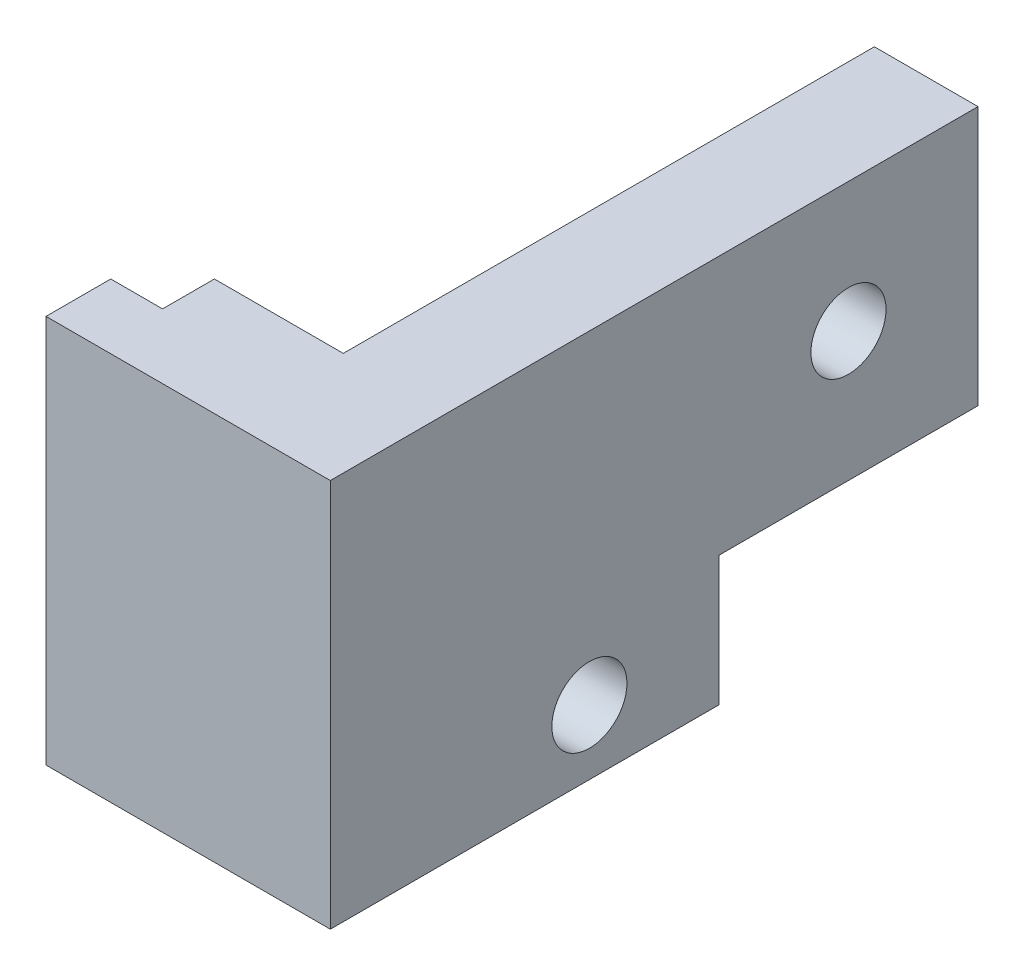
ISO-10303-21;
HEADER;
FILE_DESCRIPTION(('STEP AP214'),'2;1');
FILE_NAME('part.step','',(''),(''),'','','');
FILE_SCHEMA(('AUTOMOTIVE_DESIGN { 1 0 10303 214 1 1 1 1 }'));
ENDSEC;
DATA;
#1=APPLICATION_CONTEXT('core data for automotive mechanical design processes');
#2=APPLICATION_PROTOCOL_DEFINITION('international standard','automotive_design',2000,#1);
#3=PRODUCT_CONTEXT('',#1,'mechanical');
#4=PRODUCT('Part','Part','',(#3));
#5=PRODUCT_RELATED_PRODUCT_CATEGORY('part','',(#4));
#6=PRODUCT_DEFINITION_FORMATION('','',#4);
#7=PRODUCT_DEFINITION_CONTEXT('part definition',#1,'design');
#8=PRODUCT_DEFINITION('design','',#6,#7);
#9=PRODUCT_DEFINITION_SHAPE('','',#8);
#10=(LENGTH_UNIT() NAMED_UNIT(*) SI_UNIT(.MILLI.,.METRE.));
#11=(NAMED_UNIT(*) PLANE_ANGLE_UNIT() SI_UNIT($,.RADIAN.));
#12=(NAMED_UNIT(*) SI_UNIT($,.STERADIAN.) SOLID_ANGLE_UNIT());
#13=UNCERTAINTY_MEASURE_WITH_UNIT(LENGTH_MEASURE(1.E-05),#10,'distance_accuracy_value','');
#14=(GEOMETRIC_REPRESENTATION_CONTEXT(3) GLOBAL_UNCERTAINTY_ASSIGNED_CONTEXT((#13)) GLOBAL_UNIT_ASSIGNED_CONTEXT((#10,
#11,#12)) REPRESENTATION_CONTEXT('',''));
#15=CARTESIAN_POINT('',(0.,0.,0.));
#16=DIRECTION('',(0.,0.,1.));
#17=DIRECTION('',(1.,0.,0.));
#18=AXIS2_PLACEMENT_3D('',#15,#16,#17);
#19=CARTESIAN_POINT('',(0.,0.,0.));
#20=DIRECTION('',(0.,0.,1.));
#21=DIRECTION('',(1.,0.,0.));
#22=AXIS2_PLACEMENT_3D('',#19,#20,#21);
#23=PLANE('',#22);
#24=DIRECTION('',(1.,0.,0.));
#25=VECTOR('',#24,1.);
#26=CARTESIAN_POINT('',(0.,0.,0.));
#27=LINE('',#26,#25);
#28=CARTESIAN_POINT('',(-33.95,0.,0.));
#29=VERTEX_POINT('',#28);
#30=CARTESIAN_POINT('',(-29.95,0.,0.));
#31=VERTEX_POINT('',#30);
#32=EDGE_CURVE('E143',#29,#31,#27,.T.);
#33=ORIENTED_EDGE('',*,*,#32,.F.);
#34=DIRECTION('',(0.,-1.,0.));
#35=VECTOR('',#34,1.);
#36=CARTESIAN_POINT('',(-33.95,30.,0.));
#37=LINE('',#36,#35);
#38=CARTESIAN_POINT('',(-33.95,30.,0.));
#39=VERTEX_POINT('',#38);
#40=EDGE_CURVE('E137',#39,#29,#37,.T.);
#41=ORIENTED_EDGE('',*,*,#40,.F.);
#42=DIRECTION('',(-1.,0.,0.));
#43=VECTOR('',#42,1.);
#44=CARTESIAN_POINT('',(0.,30.,0.));
#45=LINE('',#44,#43);
#46=CARTESIAN_POINT('',(-29.95,30.,0.));
#47=VERTEX_POINT('',#46);
#48=EDGE_CURVE('E64',#47,#39,#45,.T.);
#49=ORIENTED_EDGE('',*,*,#48,.F.);
#50=DIRECTION('',(0.,1.,0.));
#51=VECTOR('',#50,1.);
#52=CARTESIAN_POINT('',(-29.95,30.,0.));
#53=LINE('',#52,#51);
#54=EDGE_CURVE('E542',#31,#47,#53,.T.);
#55=ORIENTED_EDGE('',*,*,#54,.F.);
#56=EDGE_LOOP('',(#33,#41,#49,#55));
#57=FACE_BOUND('',#56,.T.);
#58=ADVANCED_FACE('F39',(#57),#23,.F.);
#59=CARTESIAN_POINT('',(-20.,30.,-5.));
#60=DIRECTION('',(1.,0.,0.));
#61=DIRECTION('',(0.,0.,-1.));
#62=AXIS2_PLACEMENT_3D('',#59,#60,#61);
#63=PLANE('',#62);
#64=CARTESIAN_POINT('',(-20.,5.,-15.));
#65=DIRECTION('',(1.,0.,0.));
#66=DIRECTION('',(0.,0.,-1.));
#67=AXIS2_PLACEMENT_3D('',#64,#65,#66);
#68=CIRCLE('',#67,1.5);
#69=CARTESIAN_POINT('',(-20.,5.,-16.5));
#70=VERTEX_POINT('',#69);
#71=EDGE_CURVE('E156',#70,#70,#68,.T.);
#72=ORIENTED_EDGE('',*,*,#71,.T.);
#73=EDGE_LOOP('',(#72));
#74=FACE_BOUND('',#73,.T.);
#75=CARTESIAN_POINT('',(-20.,20.,-35.));
#76=DIRECTION('',(1.,0.,0.));
#77=DIRECTION('',(0.,0.,-1.));
#78=AXIS2_PLACEMENT_3D('',#75,#76,#77);
#79=CIRCLE('',#78,1.5);
#80=CARTESIAN_POINT('',(-20.,20.,-36.5));
#81=VERTEX_POINT('',#80);
#82=EDGE_CURVE('E233',#81,#81,#79,.T.);
#83=ORIENTED_EDGE('',*,*,#82,.T.);
#84=EDGE_LOOP('',(#83));
#85=FACE_BOUND('',#84,.T.);
#86=DIRECTION('',(0.,-1.,0.));
#87=VECTOR('',#86,1.);
#88=CARTESIAN_POINT('',(-20.,30.,-4.));
#89=LINE('',#88,#87);
#90=CARTESIAN_POINT('',(-20.,30.,-4.));
#91=VERTEX_POINT('',#90);
#92=CARTESIAN_POINT('',(-20.,0.,-4.));
#93=VERTEX_POINT('',#92);
#94=EDGE_CURVE('E279',#91,#93,#89,.T.);
#95=ORIENTED_EDGE('',*,*,#94,.F.);
#96=DIRECTION('',(0.,0.,1.));
#97=VECTOR('',#96,1.);
#98=CARTESIAN_POINT('',(-20.,30.,-5.));
#99=LINE('',#98,#97);
#100=CARTESIAN_POINT('',(-20.,30.,-45.));
#101=VERTEX_POINT('',#100);
#102=EDGE_CURVE('E151',#101,#91,#99,.T.);
#103=ORIENTED_EDGE('',*,*,#102,.F.);
#104=DIRECTION('',(0.,1.,0.));
#105=VECTOR('',#104,1.);
#106=CARTESIAN_POINT('',(-20.,30.,-45.));
#107=LINE('',#106,#105);
#108=CARTESIAN_POINT('',(-20.,17.,-45.));
#109=VERTEX_POINT('',#108);
#110=EDGE_CURVE('E205',#109,#101,#107,.T.);
#111=ORIENTED_EDGE('',*,*,#110,.F.);
#112=DIRECTION('',(0.,0.,-1.));
#113=VECTOR('',#112,1.);
#114=CARTESIAN_POINT('',(-20.,17.,-45.));
#115=LINE('',#114,#113);
#116=CARTESIAN_POINT('',(-20.,17.,-18.));
#117=VERTEX_POINT('',#116);
#118=EDGE_CURVE('E226',#117,#109,#115,.T.);
#119=ORIENTED_EDGE('',*,*,#118,.F.);
#120=DIRECTION('',(0.,1.,0.));
#121=VECTOR('',#120,1.);
#122=CARTESIAN_POINT('',(-20.,0.,-18.));
#123=LINE('',#122,#121);
#124=CARTESIAN_POINT('',(-20.,0.,-18.));
#125=VERTEX_POINT('',#124);
#126=EDGE_CURVE('E230',#125,#117,#123,.T.);
#127=ORIENTED_EDGE('',*,*,#126,.F.);
#128=DIRECTION('',(0.,0.,1.));
#129=VECTOR('',#128,1.);
#130=CARTESIAN_POINT('',(-20.,0.,-5.));
#131=LINE('',#130,#129);
#132=EDGE_CURVE('E148',#125,#93,#131,.T.);
#133=ORIENTED_EDGE('',*,*,#132,.T.);
#134=EDGE_LOOP('',(#95,#103,#111,#119,#127,#133));
#135=FACE_BOUND('',#134,.T.);
#136=ADVANCED_FACE('F260',(#74,#85,#135),#63,.F.);
#137=CARTESIAN_POINT('',(-26.2,20.,-35.));
#138=DIRECTION('',(1.,0.,0.));
#139=DIRECTION('',(0.,0.,-1.));
#140=AXIS2_PLACEMENT_3D('',#137,#138,#139);
#141=CYLINDRICAL_SURFACE('',#140,1.5);
#142=ORIENTED_EDGE('',*,*,#82,.F.);
#143=EDGE_LOOP('',(#142));
#144=FACE_BOUND('',#143,.T.);
#145=CARTESIAN_POINT('',(-18.,20.,-35.));
#146=DIRECTION('',(1.,0.,0.));
#147=DIRECTION('',(0.,0.,-1.));
#148=AXIS2_PLACEMENT_3D('',#145,#146,#147);
#149=CIRCLE('',#148,1.5);
#150=CARTESIAN_POINT('',(-18.,20.,-36.5));
#151=VERTEX_POINT('',#150);
#152=EDGE_CURVE('E43',#151,#151,#149,.F.);
#153=ORIENTED_EDGE('',*,*,#152,.F.);
#154=EDGE_LOOP('',(#153));
#155=FACE_BOUND('',#154,.T.);
#156=ADVANCED_FACE('F293',(#144,#155),#141,.F.);
#157=CARTESIAN_POINT('',(0.,0.,-25.));
#158=DIRECTION('',(0.,0.,-1.));
#159=DIRECTION('',(-1.,0.,0.));
#160=AXIS2_PLACEMENT_3D('',#157,#158,#159);
#161=PLANE('',#160);
#162=DIRECTION('',(-1.,0.,0.));
#163=VECTOR('',#162,1.);
#164=CARTESIAN_POINT('',(-15.,0.,-25.));
#165=LINE('',#164,#163);
#166=CARTESIAN_POINT('',(-12.,0.,-25.));
#167=VERTEX_POINT('',#166);
#168=CARTESIAN_POINT('',(-15.8,0.,-25.));
#169=VERTEX_POINT('',#168);
#170=EDGE_CURVE('E184',#167,#169,#165,.T.);
#171=ORIENTED_EDGE('',*,*,#170,.T.);
#172=DIRECTION('',(0.,-1.,0.));
#173=VECTOR('',#172,1.);
#174=CARTESIAN_POINT('',(-15.8,0.,-25.));
#175=LINE('',#174,#173);
#176=CARTESIAN_POINT('',(-15.8,9.99999999999999,-25.));
#177=VERTEX_POINT('',#176);
#178=EDGE_CURVE('E228',#177,#169,#175,.T.);
#179=ORIENTED_EDGE('',*,*,#178,.F.);
#180=DIRECTION('',(-1.,0.,0.));
#181=VECTOR('',#180,1.);
#182=CARTESIAN_POINT('',(-20.,9.99999999999999,-25.));
#183=LINE('',#182,#181);
#184=CARTESIAN_POINT('',(-12.,9.99999999999999,-25.));
#185=VERTEX_POINT('',#184);
#186=EDGE_CURVE('E216',#185,#177,#183,.T.);
#187=ORIENTED_EDGE('',*,*,#186,.F.);
#188=DIRECTION('',(0.,1.,0.));
#189=VECTOR('',#188,1.);
#190=CARTESIAN_POINT('',(-12.,0.,-25.));
#191=LINE('',#190,#189);
#192=EDGE_CURVE('E181',#167,#185,#191,.T.);
#193=ORIENTED_EDGE('',*,*,#192,.F.);
#194=EDGE_LOOP('',(#171,#179,#187,#193));
#195=FACE_BOUND('',#194,.T.);
#196=ADVANCED_FACE('F296',(#195),#161,.T.);
#197=CARTESIAN_POINT('',(-20.,9.99999999999999,-45.));
#198=DIRECTION('',(0.,1.,0.));
#199=DIRECTION('',(0.,0.,1.));
#200=AXIS2_PLACEMENT_3D('',#197,#198,#199);
#201=PLANE('',#200);
#202=DIRECTION('',(0.,0.,1.));
#203=VECTOR('',#202,1.);
#204=CARTESIAN_POINT('',(-15.8,9.99999999999999,-45.));
#205=LINE('',#204,#203);
#206=CARTESIAN_POINT('',(-15.8,9.99999999999999,-45.));
#207=VERTEX_POINT('',#206);
#208=EDGE_CURVE('E222',#207,#177,#205,.T.);
#209=ORIENTED_EDGE('',*,*,#208,.F.);
#210=DIRECTION('',(-1.,0.,0.));
#211=VECTOR('',#210,1.);
#212=CARTESIAN_POINT('',(-20.,9.99999999999999,-45.));
#213=LINE('',#212,#211);
#214=CARTESIAN_POINT('',(-12.,9.99999999999999,-45.));
#215=VERTEX_POINT('',#214);
#216=EDGE_CURVE('E211',#215,#207,#213,.T.);
#217=ORIENTED_EDGE('',*,*,#216,.F.);
#218=DIRECTION('',(0.,0.,1.));
#219=VECTOR('',#218,1.);
#220=CARTESIAN_POINT('',(-12.,9.99999999999999,-45.));
#221=LINE('',#220,#219);
#222=EDGE_CURVE('E169',#215,#185,#221,.T.);
#223=ORIENTED_EDGE('',*,*,#222,.T.);
#224=ORIENTED_EDGE('',*,*,#186,.T.);
#225=EDGE_LOOP('',(#209,#217,#223,#224));
#226=FACE_BOUND('',#225,.T.);
#227=ADVANCED_FACE('F221',(#226),#201,.F.);
#228=CARTESIAN_POINT('',(-25.,5.,-15.));
#229=DIRECTION('',(1.,0.,0.));
#230=DIRECTION('',(0.,0.,-1.));
#231=AXIS2_PLACEMENT_3D('',#228,#229,#230);
#232=CYLINDRICAL_SURFACE('',#231,1.5);
#233=ORIENTED_EDGE('',*,*,#71,.F.);
#234=EDGE_LOOP('',(#233));
#235=FACE_BOUND('',#234,.T.);
#236=CARTESIAN_POINT('',(-18.,5.,-15.));
#237=DIRECTION('',(1.,0.,0.));
#238=DIRECTION('',(0.,0.,-1.));
#239=AXIS2_PLACEMENT_3D('',#236,#237,#238);
#240=CIRCLE('',#239,1.5);
#241=CARTESIAN_POINT('',(-18.,5.,-16.5));
#242=VERTEX_POINT('',#241);
#243=EDGE_CURVE('E154',#242,#242,#240,.F.);
#244=ORIENTED_EDGE('',*,*,#243,.F.);
#245=EDGE_LOOP('',(#244));
#246=FACE_BOUND('',#245,.T.);
#247=ADVANCED_FACE('F318',(#235,#246),#232,.F.);
#248=CARTESIAN_POINT('',(0.,30.,5.));
#249=DIRECTION('',(0.,-1.,0.));
#250=DIRECTION('',(1.,0.,0.));
#251=AXIS2_PLACEMENT_3D('',#248,#249,#250);
#252=PLANE('',#251);
#253=ORIENTED_EDGE('',*,*,#48,.T.);
#254=DIRECTION('',(0.,0.,-1.));
#255=VECTOR('',#254,1.);
#256=CARTESIAN_POINT('',(-33.95,30.,5.));
#257=LINE('',#256,#255);
#258=CARTESIAN_POINT('',(-33.95,30.,5.));
#259=VERTEX_POINT('',#258);
#260=EDGE_CURVE('E135',#259,#39,#257,.T.);
#261=ORIENTED_EDGE('',*,*,#260,.F.);
#262=DIRECTION('',(-1.,0.,0.));
#263=VECTOR('',#262,1.);
#264=CARTESIAN_POINT('',(0.,30.,5.));
#265=LINE('',#264,#263);
#266=CARTESIAN_POINT('',(-12.,30.,5.));
#267=VERTEX_POINT('',#266);
#268=EDGE_CURVE('E48',#267,#259,#265,.T.);
#269=ORIENTED_EDGE('',*,*,#268,.F.);
#270=DIRECTION('',(0.,0.,1.));
#271=VECTOR('',#270,1.);
#272=CARTESIAN_POINT('',(-12.,30.,-25.));
#273=LINE('',#272,#271);
#274=CARTESIAN_POINT('',(-12.,30.,-45.));
#275=VERTEX_POINT('',#274);
#276=EDGE_CURVE('E161',#275,#267,#273,.T.);
#277=ORIENTED_EDGE('',*,*,#276,.F.);
#278=DIRECTION('',(1.,0.,0.));
#279=VECTOR('',#278,1.);
#280=CARTESIAN_POINT('',(-20.,30.,-45.));
#281=LINE('',#280,#279);
#282=EDGE_CURVE('E194',#101,#275,#281,.T.);
#283=ORIENTED_EDGE('',*,*,#282,.F.);
#284=ORIENTED_EDGE('',*,*,#102,.T.);
#285=DIRECTION('',(1.,0.,0.));
#286=VECTOR('',#285,1.);
#287=CARTESIAN_POINT('',(-29.95,30.,-4.));
#288=LINE('',#287,#286);
#289=CARTESIAN_POINT('',(-29.95,30.,-4.));
#290=VERTEX_POINT('',#289);
#291=EDGE_CURVE('E271',#290,#91,#288,.T.);
#292=ORIENTED_EDGE('',*,*,#291,.F.);
#293=DIRECTION('',(0.,0.,-1.));
#294=VECTOR('',#293,1.);
#295=CARTESIAN_POINT('',(-29.95,30.,0.));
#296=LINE('',#295,#294);
#297=EDGE_CURVE('E146',#47,#290,#296,.T.);
#298=ORIENTED_EDGE('',*,*,#297,.F.);
#299=EDGE_LOOP('',(#253,#261,#269,#277,#283,#284,#292,#298));
#300=FACE_BOUND('',#299,.T.);
#301=ADVANCED_FACE('F41',(#300),#252,.F.);
#302=CARTESIAN_POINT('',(0.,0.,5.));
#303=DIRECTION('',(0.,1.,0.));
#304=DIRECTION('',(-1.,0.,0.));
#305=AXIS2_PLACEMENT_3D('',#302,#303,#304);
#306=PLANE('',#305);
#307=DIRECTION('',(1.,0.,0.));
#308=VECTOR('',#307,1.);
#309=CARTESIAN_POINT('',(0.,0.,5.));
#310=LINE('',#309,#308);
#311=CARTESIAN_POINT('',(-33.95,0.,5.));
#312=VERTEX_POINT('',#311);
#313=CARTESIAN_POINT('',(-12.,0.,5.));
#314=VERTEX_POINT('',#313);
#315=EDGE_CURVE('E13',#312,#314,#310,.T.);
#316=ORIENTED_EDGE('',*,*,#315,.F.);
#317=DIRECTION('',(0.,0.,1.));
#318=VECTOR('',#317,1.);
#319=CARTESIAN_POINT('',(-33.95,0.,0.));
#320=LINE('',#319,#318);
#321=EDGE_CURVE('E56',#29,#312,#320,.T.);
#322=ORIENTED_EDGE('',*,*,#321,.F.);
#323=ORIENTED_EDGE('',*,*,#32,.T.);
#324=DIRECTION('',(0.,0.,1.));
#325=VECTOR('',#324,1.);
#326=CARTESIAN_POINT('',(-29.95,0.,0.));
#327=LINE('',#326,#325);
#328=CARTESIAN_POINT('',(-29.95,0.,-4.));
#329=VERTEX_POINT('',#328);
#330=EDGE_CURVE('E268',#329,#31,#327,.T.);
#331=ORIENTED_EDGE('',*,*,#330,.F.);
#332=DIRECTION('',(1.,0.,0.));
#333=VECTOR('',#332,1.);
#334=CARTESIAN_POINT('',(-29.95,0.,-4.));
#335=LINE('',#334,#333);
#336=EDGE_CURVE('E266',#329,#93,#335,.T.);
#337=ORIENTED_EDGE('',*,*,#336,.T.);
#338=ORIENTED_EDGE('',*,*,#132,.F.);
#339=DIRECTION('',(-1.,0.,0.));
#340=VECTOR('',#339,1.);
#341=CARTESIAN_POINT('',(-15.8,0.,-18.));
#342=LINE('',#341,#340);
#343=CARTESIAN_POINT('',(-15.8,0.,-18.));
#344=VERTEX_POINT('',#343);
#345=EDGE_CURVE('E245',#344,#125,#342,.T.);
#346=ORIENTED_EDGE('',*,*,#345,.F.);
#347=DIRECTION('',(0.,0.,1.));
#348=VECTOR('',#347,1.);
#349=CARTESIAN_POINT('',(-15.8,0.,-25.));
#350=LINE('',#349,#348);
#351=EDGE_CURVE('E237',#169,#344,#350,.T.);
#352=ORIENTED_EDGE('',*,*,#351,.F.);
#353=ORIENTED_EDGE('',*,*,#170,.F.);
#354=DIRECTION('',(0.,0.,-1.));
#355=VECTOR('',#354,1.);
#356=CARTESIAN_POINT('',(-12.,0.,5.));
#357=LINE('',#356,#355);
#358=EDGE_CURVE('E178',#314,#167,#357,.T.);
#359=ORIENTED_EDGE('',*,*,#358,.F.);
#360=EDGE_LOOP('',(#316,#322,#323,#331,#337,#338,#346,#352,#353,#359));
#361=FACE_BOUND('',#360,.T.);
#362=ADVANCED_FACE('F263',(#361),#306,.F.);
#363=CARTESIAN_POINT('',(0.,0.,5.));
#364=DIRECTION('',(0.,0.,1.));
#365=DIRECTION('',(1.,0.,0.));
#366=AXIS2_PLACEMENT_3D('',#363,#364,#365);
#367=PLANE('',#366);
#368=DIRECTION('',(0.,1.,0.));
#369=VECTOR('',#368,1.);
#370=CARTESIAN_POINT('',(-33.95,0.,5.));
#371=LINE('',#370,#369);
#372=EDGE_CURVE('E138',#312,#259,#371,.T.);
#373=ORIENTED_EDGE('',*,*,#372,.F.);
#374=ORIENTED_EDGE('',*,*,#315,.T.);
#375=DIRECTION('',(0.,-1.,0.));
#376=VECTOR('',#375,1.);
#377=CARTESIAN_POINT('',(-12.,30.,5.));
#378=LINE('',#377,#376);
#379=EDGE_CURVE('E175',#267,#314,#378,.T.);
#380=ORIENTED_EDGE('',*,*,#379,.F.);
#381=ORIENTED_EDGE('',*,*,#268,.T.);
#382=EDGE_LOOP('',(#373,#374,#380,#381));
#383=FACE_BOUND('',#382,.T.);
#384=ADVANCED_FACE('F190',(#383),#367,.T.);
#385=CARTESIAN_POINT('',(-12.,0.,0.));
#386=DIRECTION('',(1.,0.,0.));
#387=DIRECTION('',(0.,0.,-1.));
#388=AXIS2_PLACEMENT_3D('',#385,#386,#387);
#389=PLANE('',#388);
#390=CARTESIAN_POINT('',(-12.,20.,-35.));
#391=DIRECTION('',(1.,0.,0.));
#392=DIRECTION('',(0.,0.,-1.));
#393=AXIS2_PLACEMENT_3D('',#390,#391,#392);
#394=CIRCLE('',#393,2.9);
#395=CARTESIAN_POINT('',(-12.,20.,-37.9));
#396=VERTEX_POINT('',#395);
#397=EDGE_CURVE('E274',#396,#396,#394,.T.);
#398=ORIENTED_EDGE('',*,*,#397,.F.);
#399=EDGE_LOOP('',(#398));
#400=FACE_BOUND('',#399,.T.);
#401=CARTESIAN_POINT('',(-12.,5.,-15.));
#402=DIRECTION('',(1.,0.,0.));
#403=DIRECTION('',(0.,0.,-1.));
#404=AXIS2_PLACEMENT_3D('',#401,#402,#403);
#405=CIRCLE('',#404,2.9);
#406=CARTESIAN_POINT('',(-12.,5.,-17.9));
#407=VERTEX_POINT('',#406);
#408=EDGE_CURVE('E164',#407,#407,#405,.T.);
#409=ORIENTED_EDGE('',*,*,#408,.F.);
#410=EDGE_LOOP('',(#409));
#411=FACE_BOUND('',#410,.T.);
#412=ORIENTED_EDGE('',*,*,#276,.T.);
#413=ORIENTED_EDGE('',*,*,#379,.T.);
#414=ORIENTED_EDGE('',*,*,#358,.T.);
#415=ORIENTED_EDGE('',*,*,#192,.T.);
#416=ORIENTED_EDGE('',*,*,#222,.F.);
#417=DIRECTION('',(0.,-1.,0.));
#418=VECTOR('',#417,1.);
#419=CARTESIAN_POINT('',(-12.,30.,-45.));
#420=LINE('',#419,#418);
#421=EDGE_CURVE('E201',#275,#215,#420,.T.);
#422=ORIENTED_EDGE('',*,*,#421,.F.);
#423=EDGE_LOOP('',(#412,#413,#414,#415,#416,#422));
#424=FACE_BOUND('',#423,.T.);
#425=ADVANCED_FACE('F208',(#400,#411,#424),#389,.T.);
#426=CARTESIAN_POINT('',(-18.,30.,-5.));
#427=DIRECTION('',(1.,0.,0.));
#428=DIRECTION('',(0.,0.,-1.));
#429=AXIS2_PLACEMENT_3D('',#426,#427,#428);
#430=PLANE('',#429);
#431=CARTESIAN_POINT('',(-18.,5.,-15.));
#432=DIRECTION('',(1.,0.,0.));
#433=DIRECTION('',(0.,0.,-1.));
#434=AXIS2_PLACEMENT_3D('',#431,#432,#433);
#435=CIRCLE('',#434,2.9);
#436=CARTESIAN_POINT('',(-18.,5.,-17.9));
#437=VERTEX_POINT('',#436);
#438=EDGE_CURVE('E157',#437,#437,#435,.F.);
#439=ORIENTED_EDGE('',*,*,#438,.F.);
#440=EDGE_LOOP('',(#439));
#441=FACE_BOUND('',#440,.T.);
#442=ORIENTED_EDGE('',*,*,#243,.T.);
#443=EDGE_LOOP('',(#442));
#444=FACE_BOUND('',#443,.T.);
#445=ADVANCED_FACE('F335',(#441,#444),#430,.T.);
#446=CARTESIAN_POINT('',(-28.2024386617639,5.,-15.));
#447=DIRECTION('',(1.,0.,0.));
#448=DIRECTION('',(0.,0.,-1.));
#449=AXIS2_PLACEMENT_3D('',#446,#447,#448);
#450=CYLINDRICAL_SURFACE('',#449,2.9);
#451=ORIENTED_EDGE('',*,*,#438,.T.);
#452=EDGE_LOOP('',(#451));
#453=FACE_BOUND('',#452,.T.);
#454=ORIENTED_EDGE('',*,*,#408,.T.);
#455=EDGE_LOOP('',(#454));
#456=FACE_BOUND('',#455,.T.);
#457=ADVANCED_FACE('F332',(#453,#456),#450,.F.);
#458=CARTESIAN_POINT('',(0.,0.,-45.));
#459=DIRECTION('',(0.,0.,1.));
#460=DIRECTION('',(1.,0.,0.));
#461=AXIS2_PLACEMENT_3D('',#458,#459,#460);
#462=PLANE('',#461);
#463=DIRECTION('',(0.,-1.,0.));
#464=VECTOR('',#463,1.);
#465=CARTESIAN_POINT('',(-15.8,17.,-45.));
#466=LINE('',#465,#464);
#467=CARTESIAN_POINT('',(-15.8,17.,-45.));
#468=VERTEX_POINT('',#467);
#469=EDGE_CURVE('E223',#468,#207,#466,.T.);
#470=ORIENTED_EDGE('',*,*,#469,.F.);
#471=DIRECTION('',(-1.,0.,0.));
#472=VECTOR('',#471,1.);
#473=CARTESIAN_POINT('',(-15.8,17.,-45.));
#474=LINE('',#473,#472);
#475=EDGE_CURVE('E218',#468,#109,#474,.T.);
#476=ORIENTED_EDGE('',*,*,#475,.T.);
#477=ORIENTED_EDGE('',*,*,#110,.T.);
#478=ORIENTED_EDGE('',*,*,#282,.T.);
#479=ORIENTED_EDGE('',*,*,#421,.T.);
#480=ORIENTED_EDGE('',*,*,#216,.T.);
#481=EDGE_LOOP('',(#470,#476,#477,#478,#479,#480));
#482=FACE_BOUND('',#481,.T.);
#483=ADVANCED_FACE('F199',(#482),#462,.F.);
#484=CARTESIAN_POINT('',(-15.8,17.,-45.));
#485=DIRECTION('',(0.,1.,0.));
#486=DIRECTION('',(0.,0.,1.));
#487=AXIS2_PLACEMENT_3D('',#484,#485,#486);
#488=PLANE('',#487);
#489=ORIENTED_EDGE('',*,*,#118,.T.);
#490=ORIENTED_EDGE('',*,*,#475,.F.);
#491=DIRECTION('',(0.,0.,-1.));
#492=VECTOR('',#491,1.);
#493=CARTESIAN_POINT('',(-15.8,17.,-25.));
#494=LINE('',#493,#492);
#495=CARTESIAN_POINT('',(-15.8,17.,-18.));
#496=VERTEX_POINT('',#495);
#497=EDGE_CURVE('E243',#496,#468,#494,.T.);
#498=ORIENTED_EDGE('',*,*,#497,.F.);
#499=DIRECTION('',(-1.,0.,0.));
#500=VECTOR('',#499,1.);
#501=CARTESIAN_POINT('',(-15.8,17.,-18.));
#502=LINE('',#501,#500);
#503=EDGE_CURVE('E249',#496,#117,#502,.T.);
#504=ORIENTED_EDGE('',*,*,#503,.T.);
#505=EDGE_LOOP('',(#489,#490,#498,#504));
#506=FACE_BOUND('',#505,.T.);
#507=ADVANCED_FACE('F349',(#506),#488,.F.);
#508=CARTESIAN_POINT('',(-15.8,0.,-18.));
#509=DIRECTION('',(0.,0.,1.));
#510=DIRECTION('',(1.,0.,0.));
#511=AXIS2_PLACEMENT_3D('',#508,#509,#510);
#512=PLANE('',#511);
#513=ORIENTED_EDGE('',*,*,#126,.T.);
#514=ORIENTED_EDGE('',*,*,#503,.F.);
#515=DIRECTION('',(0.,1.,0.));
#516=VECTOR('',#515,1.);
#517=CARTESIAN_POINT('',(-15.8,0.,-18.));
#518=LINE('',#517,#516);
#519=EDGE_CURVE('E240',#344,#496,#518,.T.);
#520=ORIENTED_EDGE('',*,*,#519,.F.);
#521=ORIENTED_EDGE('',*,*,#345,.T.);
#522=EDGE_LOOP('',(#513,#514,#520,#521));
#523=FACE_BOUND('',#522,.T.);
#524=ADVANCED_FACE('F254',(#523),#512,.F.);
#525=CARTESIAN_POINT('',(-15.8,0.,0.));
#526=DIRECTION('',(-1.,0.,0.));
#527=DIRECTION('',(0.,0.,1.));
#528=AXIS2_PLACEMENT_3D('',#525,#526,#527);
#529=PLANE('',#528);
#530=ORIENTED_EDGE('',*,*,#469,.T.);
#531=ORIENTED_EDGE('',*,*,#208,.T.);
#532=ORIENTED_EDGE('',*,*,#178,.T.);
#533=ORIENTED_EDGE('',*,*,#351,.T.);
#534=ORIENTED_EDGE('',*,*,#519,.T.);
#535=ORIENTED_EDGE('',*,*,#497,.T.);
#536=EDGE_LOOP('',(#530,#531,#532,#533,#534,#535));
#537=FACE_BOUND('',#536,.T.);
#538=ADVANCED_FACE('F358',(#537),#529,.T.);
#539=CARTESIAN_POINT('',(-18.,30.,-5.));
#540=DIRECTION('',(1.,0.,0.));
#541=DIRECTION('',(0.,0.,-1.));
#542=AXIS2_PLACEMENT_3D('',#539,#540,#541);
#543=PLANE('',#542);
#544=CARTESIAN_POINT('',(-18.,20.,-35.));
#545=DIRECTION('',(1.,0.,0.));
#546=DIRECTION('',(0.,0.,-1.));
#547=AXIS2_PLACEMENT_3D('',#544,#545,#546);
#548=CIRCLE('',#547,2.9);
#549=CARTESIAN_POINT('',(-18.,20.,-37.9));
#550=VERTEX_POINT('',#549);
#551=EDGE_CURVE('E282',#550,#550,#548,.F.);
#552=ORIENTED_EDGE('',*,*,#551,.F.);
#553=EDGE_LOOP('',(#552));
#554=FACE_BOUND('',#553,.T.);
#555=ORIENTED_EDGE('',*,*,#152,.T.);
#556=EDGE_LOOP('',(#555));
#557=FACE_BOUND('',#556,.T.);
#558=ADVANCED_FACE('F360',(#554,#557),#543,.T.);
#559=CARTESIAN_POINT('',(-28.2024386617639,20.,-35.));
#560=DIRECTION('',(1.,0.,0.));
#561=DIRECTION('',(0.,0.,-1.));
#562=AXIS2_PLACEMENT_3D('',#559,#560,#561);
#563=CYLINDRICAL_SURFACE('',#562,2.9);
#564=ORIENTED_EDGE('',*,*,#551,.T.);
#565=EDGE_LOOP('',(#564));
#566=FACE_BOUND('',#565,.T.);
#567=ORIENTED_EDGE('',*,*,#397,.T.);
#568=EDGE_LOOP('',(#567));
#569=FACE_BOUND('',#568,.T.);
#570=ADVANCED_FACE('F364',(#566,#569),#563,.F.);
#571=CARTESIAN_POINT('',(-29.95,30.,-4.));
#572=DIRECTION('',(0.,0.,1.));
#573=DIRECTION('',(0.,-1.,0.));
#574=AXIS2_PLACEMENT_3D('',#571,#572,#573);
#575=PLANE('',#574);
#576=ORIENTED_EDGE('',*,*,#94,.T.);
#577=ORIENTED_EDGE('',*,*,#336,.F.);
#578=DIRECTION('',(0.,-1.,0.));
#579=VECTOR('',#578,1.);
#580=CARTESIAN_POINT('',(-29.95,30.,-4.));
#581=LINE('',#580,#579);
#582=EDGE_CURVE('E276',#290,#329,#581,.T.);
#583=ORIENTED_EDGE('',*,*,#582,.F.);
#584=ORIENTED_EDGE('',*,*,#291,.T.);
#585=EDGE_LOOP('',(#576,#577,#583,#584));
#586=FACE_BOUND('',#585,.T.);
#587=ADVANCED_FACE('F370',(#586),#575,.F.);
#588=CARTESIAN_POINT('',(-29.95,0.,0.));
#589=DIRECTION('',(1.,0.,0.));
#590=DIRECTION('',(0.,0.,-1.));
#591=AXIS2_PLACEMENT_3D('',#588,#589,#590);
#592=PLANE('',#591);
#593=ORIENTED_EDGE('',*,*,#54,.T.);
#594=ORIENTED_EDGE('',*,*,#297,.T.);
#595=ORIENTED_EDGE('',*,*,#582,.T.);
#596=ORIENTED_EDGE('',*,*,#330,.T.);
#597=EDGE_LOOP('',(#593,#594,#595,#596));
#598=FACE_BOUND('',#597,.T.);
#599=ADVANCED_FACE('F374',(#598),#592,.F.);
#600=CARTESIAN_POINT('',(-33.95,0.,0.));
#601=DIRECTION('',(1.,0.,0.));
#602=DIRECTION('',(0.,0.,-1.));
#603=AXIS2_PLACEMENT_3D('',#600,#601,#602);
#604=PLANE('',#603);
#605=ORIENTED_EDGE('',*,*,#372,.T.);
#606=ORIENTED_EDGE('',*,*,#260,.T.);
#607=ORIENTED_EDGE('',*,*,#40,.T.);
#608=ORIENTED_EDGE('',*,*,#321,.T.);
#609=EDGE_LOOP('',(#605,#606,#607,#608));
#610=FACE_BOUND('',#609,.T.);
#611=ADVANCED_FACE('F136',(#610),#604,.F.);
#612=CLOSED_SHELL('',(#58,#136,#156,#196,#227,#247,#301,#362,#384,#425,#445,#457,#483,#507,#524,
#538,#558,#570,#587,#599,#611));
#613=MANIFOLD_SOLID_BREP('B2',#612);
#614=ADVANCED_BREP_SHAPE_REPRESENTATION('',(#18,#613),#14);
#615=SHAPE_DEFINITION_REPRESENTATION(#9,#614);
ENDSEC;
END-ISO-10303-21;
